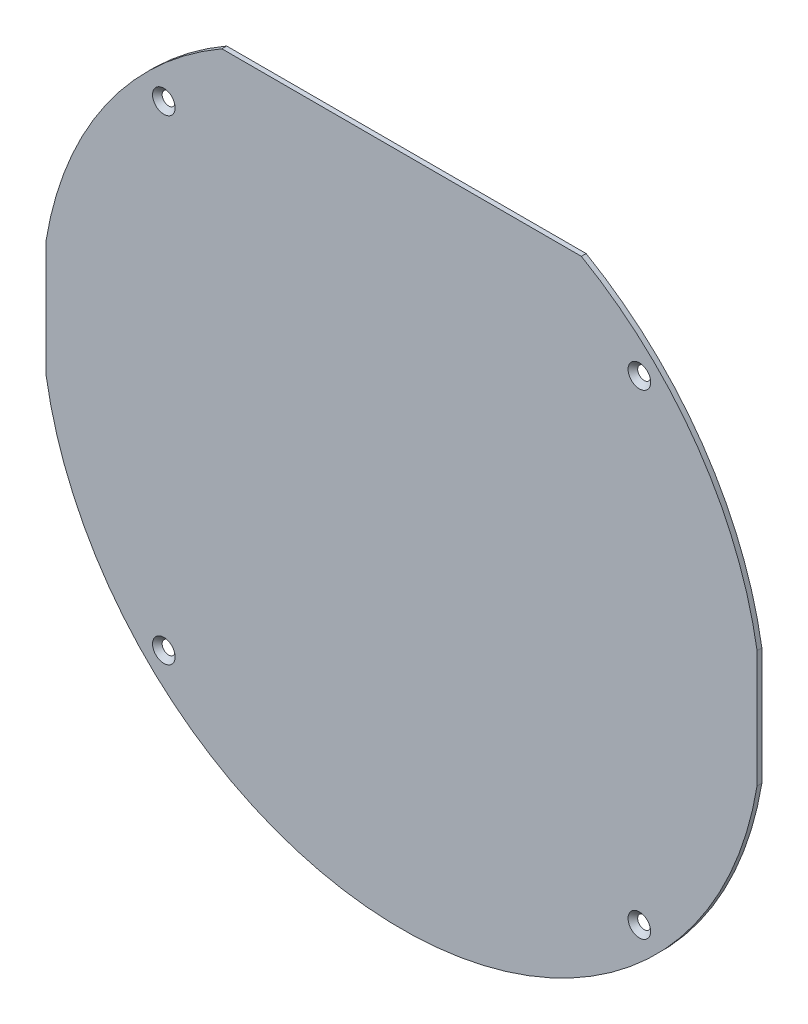
ISO-10303-21;
HEADER;
FILE_DESCRIPTION(('STEP AP214'),'2;1');
FILE_NAME('part.step','',(''),(''),'','','');
FILE_SCHEMA(('AUTOMOTIVE_DESIGN { 1 0 10303 214 1 1 1 1 }'));
ENDSEC;
DATA;
#1=APPLICATION_CONTEXT('core data for automotive mechanical design processes');
#2=APPLICATION_PROTOCOL_DEFINITION('international standard','automotive_design',2000,#1);
#3=PRODUCT_CONTEXT('',#1,'mechanical');
#4=PRODUCT('Part','Part','',(#3));
#5=PRODUCT_RELATED_PRODUCT_CATEGORY('part','',(#4));
#6=PRODUCT_DEFINITION_FORMATION('','',#4);
#7=PRODUCT_DEFINITION_CONTEXT('part definition',#1,'design');
#8=PRODUCT_DEFINITION('design','',#6,#7);
#9=PRODUCT_DEFINITION_SHAPE('','',#8);
#10=(LENGTH_UNIT() NAMED_UNIT(*) SI_UNIT(.MILLI.,.METRE.));
#11=(NAMED_UNIT(*) PLANE_ANGLE_UNIT() SI_UNIT($,.RADIAN.));
#12=(NAMED_UNIT(*) SI_UNIT($,.STERADIAN.) SOLID_ANGLE_UNIT());
#13=UNCERTAINTY_MEASURE_WITH_UNIT(LENGTH_MEASURE(1.E-05),#10,'distance_accuracy_value','');
#14=(GEOMETRIC_REPRESENTATION_CONTEXT(3) GLOBAL_UNCERTAINTY_ASSIGNED_CONTEXT((#13)) GLOBAL_UNIT_ASSIGNED_CONTEXT((#10,
#11,#12)) REPRESENTATION_CONTEXT('',''));
#15=CARTESIAN_POINT('',(0.,0.,0.));
#16=DIRECTION('',(0.,0.,1.));
#17=DIRECTION('',(1.,0.,0.));
#18=AXIS2_PLACEMENT_3D('',#15,#16,#17);
#19=CARTESIAN_POINT('',(0.,0.,0.));
#20=DIRECTION('',(0.,0.,1.));
#21=DIRECTION('',(1.,0.,0.));
#22=AXIS2_PLACEMENT_3D('',#19,#20,#21);
#23=PLANE('',#22);
#24=CARTESIAN_POINT('',(98.9949493661164,98.9949493661169,0.));
#25=DIRECTION('',(0.,0.,1.));
#26=DIRECTION('',(1.,0.,0.));
#27=AXIS2_PLACEMENT_3D('',#24,#25,#26);
#28=CIRCLE('',#27,2.7);
#29=CARTESIAN_POINT('',(101.694949366116,98.9949493661169,0.));
#30=VERTEX_POINT('',#29);
#31=EDGE_CURVE('E184',#30,#30,#28,.T.);
#32=ORIENTED_EDGE('',*,*,#31,.T.);
#33=EDGE_LOOP('',(#32));
#34=FACE_BOUND('',#33,.T.);
#35=CARTESIAN_POINT('',(-98.9949493661164,-98.9949493661169,0.));
#36=DIRECTION('',(0.,0.,1.));
#37=DIRECTION('',(1.,0.,0.));
#38=AXIS2_PLACEMENT_3D('',#35,#36,#37);
#39=CIRCLE('',#38,2.7);
#40=CARTESIAN_POINT('',(-96.2949493661164,-98.9949493661169,0.));
#41=VERTEX_POINT('',#40);
#42=EDGE_CURVE('E38',#41,#41,#39,.T.);
#43=ORIENTED_EDGE('',*,*,#42,.T.);
#44=EDGE_LOOP('',(#43));
#45=FACE_BOUND('',#44,.T.);
#46=CARTESIAN_POINT('',(0.,0.,0.));
#47=DIRECTION('',(0.,0.,1.));
#48=DIRECTION('',(1.,0.,0.));
#49=AXIS2_PLACEMENT_3D('',#46,#47,#48);
#50=CIRCLE('',#49,150.);
#51=CARTESIAN_POINT('',(-148.,-24.4131112314675,0.));
#52=VERTEX_POINT('',#51);
#53=CARTESIAN_POINT('',(148.,-24.4131112314674,0.));
#54=VERTEX_POINT('',#53);
#55=EDGE_CURVE('E120',#52,#54,#50,.T.);
#56=ORIENTED_EDGE('',*,*,#55,.F.);
#57=DIRECTION('',(0.,-1.,0.));
#58=VECTOR('',#57,1.);
#59=CARTESIAN_POINT('',(-148.,24.4131112314674,0.));
#60=LINE('',#59,#58);
#61=CARTESIAN_POINT('',(-148.,24.4131112314674,0.));
#62=VERTEX_POINT('',#61);
#63=EDGE_CURVE('E81',#62,#52,#60,.T.);
#64=ORIENTED_EDGE('',*,*,#63,.F.);
#65=CARTESIAN_POINT('',(0.,0.,0.));
#66=DIRECTION('',(0.,0.,1.));
#67=DIRECTION('',(1.,0.,0.));
#68=AXIS2_PLACEMENT_3D('',#65,#66,#67);
#69=CIRCLE('',#68,150.);
#70=CARTESIAN_POINT('',(-74.8331477354788,130.,0.));
#71=VERTEX_POINT('',#70);
#72=EDGE_CURVE('E75',#71,#62,#69,.T.);
#73=ORIENTED_EDGE('',*,*,#72,.F.);
#74=DIRECTION('',(-1.,0.,0.));
#75=VECTOR('',#74,1.);
#76=CARTESIAN_POINT('',(-74.8331477354788,130.,0.));
#77=LINE('',#76,#75);
#78=CARTESIAN_POINT('',(74.8331477354788,130.,0.));
#79=VERTEX_POINT('',#78);
#80=EDGE_CURVE('E110',#79,#71,#77,.T.);
#81=ORIENTED_EDGE('',*,*,#80,.F.);
#82=CARTESIAN_POINT('',(0.,0.,0.));
#83=DIRECTION('',(0.,0.,1.));
#84=DIRECTION('',(1.,0.,0.));
#85=AXIS2_PLACEMENT_3D('',#82,#83,#84);
#86=CIRCLE('',#85,150.);
#87=CARTESIAN_POINT('',(148.,24.4131112314675,0.));
#88=VERTEX_POINT('',#87);
#89=EDGE_CURVE('E125',#88,#79,#86,.T.);
#90=ORIENTED_EDGE('',*,*,#89,.F.);
#91=DIRECTION('',(0.,1.,0.));
#92=VECTOR('',#91,1.);
#93=CARTESIAN_POINT('',(148.,24.4131112314675,0.));
#94=LINE('',#93,#92);
#95=EDGE_CURVE('E123',#54,#88,#94,.T.);
#96=ORIENTED_EDGE('',*,*,#95,.F.);
#97=EDGE_LOOP('',(#56,#64,#73,#81,#90,#96));
#98=FACE_BOUND('',#97,.T.);
#99=CARTESIAN_POINT('',(98.9949493661172,-98.9949493661161,0.));
#100=DIRECTION('',(0.,0.,1.));
#101=DIRECTION('',(1.,0.,0.));
#102=AXIS2_PLACEMENT_3D('',#99,#100,#101);
#103=CIRCLE('',#102,2.7);
#104=CARTESIAN_POINT('',(101.694949366117,-98.9949493661161,0.));
#105=VERTEX_POINT('',#104);
#106=EDGE_CURVE('E197',#105,#105,#103,.T.);
#107=ORIENTED_EDGE('',*,*,#106,.T.);
#108=EDGE_LOOP('',(#107));
#109=FACE_BOUND('',#108,.T.);
#110=CARTESIAN_POINT('',(-98.9949493661172,98.9949493661161,0.));
#111=DIRECTION('',(0.,0.,1.));
#112=DIRECTION('',(1.,0.,0.));
#113=AXIS2_PLACEMENT_3D('',#110,#111,#112);
#114=CIRCLE('',#113,2.7);
#115=CARTESIAN_POINT('',(-96.2949493661172,98.9949493661161,0.));
#116=VERTEX_POINT('',#115);
#117=EDGE_CURVE('E188',#116,#116,#114,.T.);
#118=ORIENTED_EDGE('',*,*,#117,.T.);
#119=EDGE_LOOP('',(#118));
#120=FACE_BOUND('',#119,.T.);
#121=ADVANCED_FACE('F34',(#34,#45,#98,#109,#120),#23,.F.);
#122=CARTESIAN_POINT('',(0.,0.,2.));
#123=DIRECTION('',(0.,0.,1.));
#124=DIRECTION('',(1.,0.,0.));
#125=AXIS2_PLACEMENT_3D('',#122,#123,#124);
#126=PLANE('',#125);
#127=CARTESIAN_POINT('',(98.9949493661164,98.9949493661169,2.));
#128=DIRECTION('',(0.,0.,1.));
#129=DIRECTION('',(1.,0.,0.));
#130=AXIS2_PLACEMENT_3D('',#127,#128,#129);
#131=CIRCLE('',#130,4.7);
#132=CARTESIAN_POINT('',(103.694949366116,98.9949493661169,2.));
#133=VERTEX_POINT('',#132);
#134=EDGE_CURVE('E182',#133,#133,#131,.T.);
#135=ORIENTED_EDGE('',*,*,#134,.F.);
#136=EDGE_LOOP('',(#135));
#137=FACE_BOUND('',#136,.T.);
#138=CARTESIAN_POINT('',(-98.9949493661172,98.9949493661161,2.));
#139=DIRECTION('',(0.,0.,1.));
#140=DIRECTION('',(1.,0.,0.));
#141=AXIS2_PLACEMENT_3D('',#138,#139,#140);
#142=CIRCLE('',#141,4.7);
#143=CARTESIAN_POINT('',(-94.2949493661172,98.9949493661161,2.));
#144=VERTEX_POINT('',#143);
#145=EDGE_CURVE('E185',#144,#144,#142,.T.);
#146=ORIENTED_EDGE('',*,*,#145,.F.);
#147=EDGE_LOOP('',(#146));
#148=FACE_BOUND('',#147,.T.);
#149=CARTESIAN_POINT('',(98.9949493661172,-98.9949493661161,2.));
#150=DIRECTION('',(0.,0.,1.));
#151=DIRECTION('',(1.,0.,0.));
#152=AXIS2_PLACEMENT_3D('',#149,#150,#151);
#153=CIRCLE('',#152,4.7);
#154=CARTESIAN_POINT('',(103.694949366117,-98.9949493661161,2.));
#155=VERTEX_POINT('',#154);
#156=EDGE_CURVE('E194',#155,#155,#153,.T.);
#157=ORIENTED_EDGE('',*,*,#156,.F.);
#158=EDGE_LOOP('',(#157));
#159=FACE_BOUND('',#158,.T.);
#160=CARTESIAN_POINT('',(-98.9949493661164,-98.9949493661169,2.));
#161=DIRECTION('',(0.,0.,1.));
#162=DIRECTION('',(1.,0.,0.));
#163=AXIS2_PLACEMENT_3D('',#160,#161,#162);
#164=CIRCLE('',#163,4.7);
#165=CARTESIAN_POINT('',(-94.2949493661164,-98.9949493661169,2.));
#166=VERTEX_POINT('',#165);
#167=EDGE_CURVE('E200',#166,#166,#164,.T.);
#168=ORIENTED_EDGE('',*,*,#167,.F.);
#169=EDGE_LOOP('',(#168));
#170=FACE_BOUND('',#169,.T.);
#171=CARTESIAN_POINT('',(0.,0.,2.));
#172=DIRECTION('',(0.,0.,1.));
#173=DIRECTION('',(1.,0.,0.));
#174=AXIS2_PLACEMENT_3D('',#171,#172,#173);
#175=CIRCLE('',#174,150.);
#176=CARTESIAN_POINT('',(-148.,-24.4131112314675,2.));
#177=VERTEX_POINT('',#176);
#178=CARTESIAN_POINT('',(148.,-24.4131112314674,2.));
#179=VERTEX_POINT('',#178);
#180=EDGE_CURVE('E130',#177,#179,#175,.T.);
#181=ORIENTED_EDGE('',*,*,#180,.T.);
#182=DIRECTION('',(0.,1.,0.));
#183=VECTOR('',#182,1.);
#184=CARTESIAN_POINT('',(148.,24.4131112314675,2.));
#185=LINE('',#184,#183);
#186=CARTESIAN_POINT('',(148.,24.4131112314675,2.));
#187=VERTEX_POINT('',#186);
#188=EDGE_CURVE('E89',#179,#187,#185,.T.);
#189=ORIENTED_EDGE('',*,*,#188,.T.);
#190=CARTESIAN_POINT('',(0.,0.,2.));
#191=DIRECTION('',(0.,0.,1.));
#192=DIRECTION('',(1.,0.,0.));
#193=AXIS2_PLACEMENT_3D('',#190,#191,#192);
#194=CIRCLE('',#193,150.);
#195=CARTESIAN_POINT('',(74.8331477354788,130.,2.));
#196=VERTEX_POINT('',#195);
#197=EDGE_CURVE('E102',#187,#196,#194,.T.);
#198=ORIENTED_EDGE('',*,*,#197,.T.);
#199=DIRECTION('',(-1.,0.,0.));
#200=VECTOR('',#199,1.);
#201=CARTESIAN_POINT('',(-74.8331477354788,130.,2.));
#202=LINE('',#201,#200);
#203=CARTESIAN_POINT('',(-74.8331477354788,130.,2.));
#204=VERTEX_POINT('',#203);
#205=EDGE_CURVE('E96',#196,#204,#202,.T.);
#206=ORIENTED_EDGE('',*,*,#205,.T.);
#207=CARTESIAN_POINT('',(0.,0.,2.));
#208=DIRECTION('',(0.,0.,1.));
#209=DIRECTION('',(1.,0.,0.));
#210=AXIS2_PLACEMENT_3D('',#207,#208,#209);
#211=CIRCLE('',#210,150.);
#212=CARTESIAN_POINT('',(-148.,24.4131112314674,2.));
#213=VERTEX_POINT('',#212);
#214=EDGE_CURVE('E100',#204,#213,#211,.T.);
#215=ORIENTED_EDGE('',*,*,#214,.T.);
#216=DIRECTION('',(0.,-1.,0.));
#217=VECTOR('',#216,1.);
#218=CARTESIAN_POINT('',(-148.,24.4131112314674,2.));
#219=LINE('',#218,#217);
#220=EDGE_CURVE('E52',#213,#177,#219,.T.);
#221=ORIENTED_EDGE('',*,*,#220,.T.);
#222=EDGE_LOOP('',(#181,#189,#198,#206,#215,#221));
#223=FACE_BOUND('',#222,.T.);
#224=ADVANCED_FACE('F98',(#137,#148,#159,#170,#223),#126,.T.);
#225=CARTESIAN_POINT('',(0.,0.,2.));
#226=DIRECTION('',(0.,0.,-1.));
#227=DIRECTION('',(-1.,0.,0.));
#228=AXIS2_PLACEMENT_3D('',#225,#226,#227);
#229=CYLINDRICAL_SURFACE('',#228,150.);
#230=ORIENTED_EDGE('',*,*,#55,.T.);
#231=DIRECTION('',(0.,0.,-1.));
#232=VECTOR('',#231,1.);
#233=CARTESIAN_POINT('',(148.,-24.4131112314674,2.));
#234=LINE('',#233,#232);
#235=EDGE_CURVE('E11',#179,#54,#234,.T.);
#236=ORIENTED_EDGE('',*,*,#235,.F.);
#237=ORIENTED_EDGE('',*,*,#180,.F.);
#238=DIRECTION('',(0.,0.,-1.));
#239=VECTOR('',#238,1.);
#240=CARTESIAN_POINT('',(-148.,-24.4131112314675,2.));
#241=LINE('',#240,#239);
#242=EDGE_CURVE('E116',#177,#52,#241,.T.);
#243=ORIENTED_EDGE('',*,*,#242,.T.);
#244=EDGE_LOOP('',(#230,#236,#237,#243));
#245=FACE_BOUND('',#244,.T.);
#246=ADVANCED_FACE('F36',(#245),#229,.T.);
#247=CARTESIAN_POINT('',(148.,24.4131112314675,2.));
#248=DIRECTION('',(-1.,0.,0.));
#249=DIRECTION('',(0.,0.,1.));
#250=AXIS2_PLACEMENT_3D('',#247,#248,#249);
#251=PLANE('',#250);
#252=ORIENTED_EDGE('',*,*,#95,.T.);
#253=DIRECTION('',(0.,0.,-1.));
#254=VECTOR('',#253,1.);
#255=CARTESIAN_POINT('',(148.,24.4131112314675,2.));
#256=LINE('',#255,#254);
#257=EDGE_CURVE('E44',#187,#88,#256,.T.);
#258=ORIENTED_EDGE('',*,*,#257,.F.);
#259=ORIENTED_EDGE('',*,*,#188,.F.);
#260=ORIENTED_EDGE('',*,*,#235,.T.);
#261=EDGE_LOOP('',(#252,#258,#259,#260));
#262=FACE_BOUND('',#261,.T.);
#263=ADVANCED_FACE('F269',(#262),#251,.F.);
#264=CARTESIAN_POINT('',(0.,0.,2.));
#265=DIRECTION('',(0.,0.,-1.));
#266=DIRECTION('',(-1.,0.,0.));
#267=AXIS2_PLACEMENT_3D('',#264,#265,#266);
#268=CYLINDRICAL_SURFACE('',#267,150.);
#269=ORIENTED_EDGE('',*,*,#89,.T.);
#270=DIRECTION('',(0.,0.,-1.));
#271=VECTOR('',#270,1.);
#272=CARTESIAN_POINT('',(74.8331477354788,130.,2.));
#273=LINE('',#272,#271);
#274=EDGE_CURVE('E111',#196,#79,#273,.T.);
#275=ORIENTED_EDGE('',*,*,#274,.F.);
#276=ORIENTED_EDGE('',*,*,#197,.F.);
#277=ORIENTED_EDGE('',*,*,#257,.T.);
#278=EDGE_LOOP('',(#269,#275,#276,#277));
#279=FACE_BOUND('',#278,.T.);
#280=ADVANCED_FACE('F137',(#279),#268,.T.);
#281=CARTESIAN_POINT('',(-74.8331477354788,130.,2.));
#282=DIRECTION('',(0.,-1.,0.));
#283=DIRECTION('',(0.,0.,-1.));
#284=AXIS2_PLACEMENT_3D('',#281,#282,#283);
#285=PLANE('',#284);
#286=ORIENTED_EDGE('',*,*,#80,.T.);
#287=DIRECTION('',(0.,0.,-1.));
#288=VECTOR('',#287,1.);
#289=CARTESIAN_POINT('',(-74.8331477354788,130.,2.));
#290=LINE('',#289,#288);
#291=EDGE_CURVE('E107',#204,#71,#290,.T.);
#292=ORIENTED_EDGE('',*,*,#291,.F.);
#293=ORIENTED_EDGE('',*,*,#205,.F.);
#294=ORIENTED_EDGE('',*,*,#274,.T.);
#295=EDGE_LOOP('',(#286,#292,#293,#294));
#296=FACE_BOUND('',#295,.T.);
#297=ADVANCED_FACE('F108',(#296),#285,.F.);
#298=CARTESIAN_POINT('',(0.,0.,2.));
#299=DIRECTION('',(0.,0.,-1.));
#300=DIRECTION('',(-1.,0.,0.));
#301=AXIS2_PLACEMENT_3D('',#298,#299,#300);
#302=CYLINDRICAL_SURFACE('',#301,150.);
#303=ORIENTED_EDGE('',*,*,#72,.T.);
#304=DIRECTION('',(0.,0.,-1.));
#305=VECTOR('',#304,1.);
#306=CARTESIAN_POINT('',(-148.,24.4131112314674,2.));
#307=LINE('',#306,#305);
#308=EDGE_CURVE('E112',#213,#62,#307,.T.);
#309=ORIENTED_EDGE('',*,*,#308,.F.);
#310=ORIENTED_EDGE('',*,*,#214,.F.);
#311=ORIENTED_EDGE('',*,*,#291,.T.);
#312=EDGE_LOOP('',(#303,#309,#310,#311));
#313=FACE_BOUND('',#312,.T.);
#314=ADVANCED_FACE('F114',(#313),#302,.T.);
#315=CARTESIAN_POINT('',(-148.,24.4131112314674,2.));
#316=DIRECTION('',(1.,0.,0.));
#317=DIRECTION('',(0.,0.,-1.));
#318=AXIS2_PLACEMENT_3D('',#315,#316,#317);
#319=PLANE('',#318);
#320=ORIENTED_EDGE('',*,*,#63,.T.);
#321=ORIENTED_EDGE('',*,*,#242,.F.);
#322=ORIENTED_EDGE('',*,*,#220,.F.);
#323=ORIENTED_EDGE('',*,*,#308,.T.);
#324=EDGE_LOOP('',(#320,#321,#322,#323));
#325=FACE_BOUND('',#324,.T.);
#326=ADVANCED_FACE('F144',(#325),#319,.F.);
#327=CARTESIAN_POINT('',(-98.9949493661164,-98.9949493661169,2.));
#328=DIRECTION('',(0.,0.,1.));
#329=DIRECTION('',(1.,0.,0.));
#330=AXIS2_PLACEMENT_3D('',#327,#328,#329);
#331=CONICAL_SURFACE('',#330,4.7,0.785398163397447);
#332=ORIENTED_EDGE('',*,*,#167,.T.);
#333=EDGE_LOOP('',(#332));
#334=FACE_BOUND('',#333,.T.);
#335=ORIENTED_EDGE('',*,*,#42,.F.);
#336=EDGE_LOOP('',(#335));
#337=FACE_BOUND('',#336,.T.);
#338=ADVANCED_FACE('F146',(#334,#337),#331,.F.);
#339=CARTESIAN_POINT('',(98.9949493661172,-98.9949493661161,2.));
#340=DIRECTION('',(0.,0.,1.));
#341=DIRECTION('',(1.,0.,0.));
#342=AXIS2_PLACEMENT_3D('',#339,#340,#341);
#343=CONICAL_SURFACE('',#342,4.7,0.785398163397447);
#344=ORIENTED_EDGE('',*,*,#156,.T.);
#345=EDGE_LOOP('',(#344));
#346=FACE_BOUND('',#345,.T.);
#347=ORIENTED_EDGE('',*,*,#106,.F.);
#348=EDGE_LOOP('',(#347));
#349=FACE_BOUND('',#348,.T.);
#350=ADVANCED_FACE('F152',(#346,#349),#343,.F.);
#351=CARTESIAN_POINT('',(-98.9949493661172,98.9949493661161,2.));
#352=DIRECTION('',(0.,0.,1.));
#353=DIRECTION('',(1.,0.,0.));
#354=AXIS2_PLACEMENT_3D('',#351,#352,#353);
#355=CONICAL_SURFACE('',#354,4.7,0.785398163397447);
#356=ORIENTED_EDGE('',*,*,#145,.T.);
#357=EDGE_LOOP('',(#356));
#358=FACE_BOUND('',#357,.T.);
#359=ORIENTED_EDGE('',*,*,#117,.F.);
#360=EDGE_LOOP('',(#359));
#361=FACE_BOUND('',#360,.T.);
#362=ADVANCED_FACE('F169',(#358,#361),#355,.F.);
#363=CARTESIAN_POINT('',(98.9949493661164,98.9949493661169,2.));
#364=DIRECTION('',(0.,0.,1.));
#365=DIRECTION('',(1.,0.,0.));
#366=AXIS2_PLACEMENT_3D('',#363,#364,#365);
#367=CONICAL_SURFACE('',#366,4.7,0.785398163397447);
#368=ORIENTED_EDGE('',*,*,#134,.T.);
#369=EDGE_LOOP('',(#368));
#370=FACE_BOUND('',#369,.T.);
#371=ORIENTED_EDGE('',*,*,#31,.F.);
#372=EDGE_LOOP('',(#371));
#373=FACE_BOUND('',#372,.T.);
#374=ADVANCED_FACE('F173',(#370,#373),#367,.F.);
#375=CLOSED_SHELL('',(#121,#224,#246,#263,#280,#297,#314,#326,#338,#350,#362,#374));
#376=MANIFOLD_SOLID_BREP('B2',#375);
#377=ADVANCED_BREP_SHAPE_REPRESENTATION('',(#18,#376),#14);
#378=SHAPE_DEFINITION_REPRESENTATION(#9,#377);
ENDSEC;
END-ISO-10303-21;
